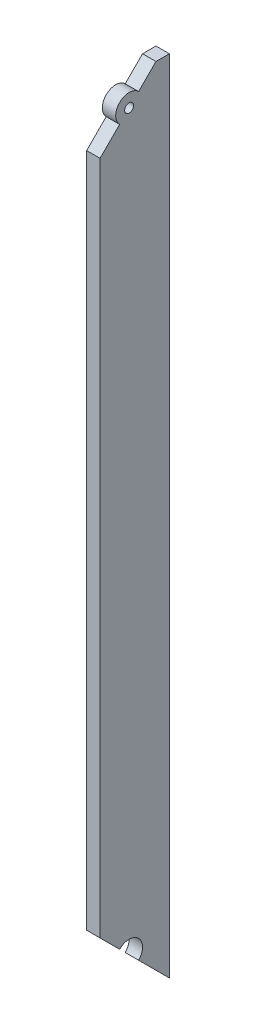
ISO-10303-21;
HEADER;
FILE_DESCRIPTION(('STEP AP214'),'2;1');
FILE_NAME('part.step','',(''),(''),'','','');
FILE_SCHEMA(('AUTOMOTIVE_DESIGN { 1 0 10303 214 1 1 1 1 }'));
ENDSEC;
DATA;
#1=APPLICATION_CONTEXT('core data for automotive mechanical design processes');
#2=APPLICATION_PROTOCOL_DEFINITION('international standard','automotive_design',2000,#1);
#3=PRODUCT_CONTEXT('',#1,'mechanical');
#4=PRODUCT('Part','Part','',(#3));
#5=PRODUCT_RELATED_PRODUCT_CATEGORY('part','',(#4));
#6=PRODUCT_DEFINITION_FORMATION('','',#4);
#7=PRODUCT_DEFINITION_CONTEXT('part definition',#1,'design');
#8=PRODUCT_DEFINITION('design','',#6,#7);
#9=PRODUCT_DEFINITION_SHAPE('','',#8);
#10=(LENGTH_UNIT() NAMED_UNIT(*) SI_UNIT(.MILLI.,.METRE.));
#11=(NAMED_UNIT(*) PLANE_ANGLE_UNIT() SI_UNIT($,.RADIAN.));
#12=(NAMED_UNIT(*) SI_UNIT($,.STERADIAN.) SOLID_ANGLE_UNIT());
#13=UNCERTAINTY_MEASURE_WITH_UNIT(LENGTH_MEASURE(1.E-05),#10,'distance_accuracy_value','');
#14=(GEOMETRIC_REPRESENTATION_CONTEXT(3) GLOBAL_UNCERTAINTY_ASSIGNED_CONTEXT((#13)) GLOBAL_UNIT_ASSIGNED_CONTEXT((#10,
#11,#12)) REPRESENTATION_CONTEXT('',''));
#15=CARTESIAN_POINT('',(0.,0.,0.));
#16=DIRECTION('',(0.,0.,1.));
#17=DIRECTION('',(1.,0.,0.));
#18=AXIS2_PLACEMENT_3D('',#15,#16,#17);
#19=CARTESIAN_POINT('',(6.,0.,0.));
#20=DIRECTION('',(0.,0.707106781186549,-0.707106781186546));
#21=DIRECTION('',(0.,0.707106781186546,0.707106781186549));
#22=AXIS2_PLACEMENT_3D('',#19,#20,#21);
#23=PLANE('',#22);
#24=DIRECTION('',(0.,-0.707106781186546,-0.707106781186549));
#25=VECTOR('',#24,1.);
#26=CARTESIAN_POINT('',(0.,0.,0.));
#27=LINE('',#26,#25);
#28=CARTESIAN_POINT('',(0.,24.9999999999999,25.));
#29=VERTEX_POINT('',#28);
#30=CARTESIAN_POINT('',(0.,16.2426406871193,16.2426406871193));
#31=VERTEX_POINT('',#30);
#32=EDGE_CURVE('E128',#29,#31,#27,.T.);
#33=ORIENTED_EDGE('',*,*,#32,.T.);
#34=DIRECTION('',(1.,0.,0.));
#35=VECTOR('',#34,1.);
#36=CARTESIAN_POINT('',(0.,16.2426406871193,16.2426406871193));
#37=LINE('',#36,#35);
#38=CARTESIAN_POINT('',(6.,16.2426406871193,16.2426406871193));
#39=VERTEX_POINT('',#38);
#40=EDGE_CURVE('E57',#31,#39,#37,.T.);
#41=ORIENTED_EDGE('',*,*,#40,.T.);
#42=DIRECTION('',(0.,-0.707106781186546,-0.707106781186549));
#43=VECTOR('',#42,1.);
#44=CARTESIAN_POINT('',(6.,0.,0.));
#45=LINE('',#44,#43);
#46=CARTESIAN_POINT('',(6.,24.9999999999999,25.));
#47=VERTEX_POINT('',#46);
#48=EDGE_CURVE('E157',#47,#39,#45,.T.);
#49=ORIENTED_EDGE('',*,*,#48,.F.);
#50=DIRECTION('',(-1.,0.,0.));
#51=VECTOR('',#50,1.);
#52=CARTESIAN_POINT('',(6.,24.9999999999999,25.));
#53=LINE('',#52,#51);
#54=EDGE_CURVE('E47',#47,#29,#53,.T.);
#55=ORIENTED_EDGE('',*,*,#54,.T.);
#56=EDGE_LOOP('',(#33,#41,#49,#55));
#57=FACE_BOUND('',#56,.T.);
#58=ADVANCED_FACE('F41',(#57),#23,.F.);
#59=CARTESIAN_POINT('',(6.,175.999999999998,176.));
#60=DIRECTION('',(0.,0.707106781186544,0.707106781186551));
#61=DIRECTION('',(0.,-0.707106781186551,0.707106781186544));
#62=AXIS2_PLACEMENT_3D('',#59,#60,#61);
#63=PLANE('',#62);
#64=DIRECTION('',(1.,0.,0.));
#65=VECTOR('',#64,1.);
#66=CARTESIAN_POINT('',(-16.9705627484772,335.75735931288,16.2426406871193));
#67=LINE('',#66,#65);
#68=CARTESIAN_POINT('',(0.,335.75735931288,16.2426406871193));
#69=VERTEX_POINT('',#68);
#70=CARTESIAN_POINT('',(6.,335.75735931288,16.2426406871193));
#71=VERTEX_POINT('',#70);
#72=EDGE_CURVE('E134',#69,#71,#67,.T.);
#73=ORIENTED_EDGE('',*,*,#72,.F.);
#74=DIRECTION('',(0.,0.707106781186552,-0.707106781186544));
#75=VECTOR('',#74,1.);
#76=CARTESIAN_POINT('',(0.,175.999999999998,176.));
#77=LINE('',#76,#75);
#78=CARTESIAN_POINT('',(0.,327.,25.));
#79=VERTEX_POINT('',#78);
#80=EDGE_CURVE('E141',#79,#69,#77,.T.);
#81=ORIENTED_EDGE('',*,*,#80,.F.);
#82=DIRECTION('',(-1.,0.,0.));
#83=VECTOR('',#82,1.);
#84=CARTESIAN_POINT('',(6.,327.,25.));
#85=LINE('',#84,#83);
#86=CARTESIAN_POINT('',(6.,327.,25.));
#87=VERTEX_POINT('',#86);
#88=EDGE_CURVE('E143',#87,#79,#85,.T.);
#89=ORIENTED_EDGE('',*,*,#88,.F.);
#90=DIRECTION('',(0.,0.707106781186552,-0.707106781186544));
#91=VECTOR('',#90,1.);
#92=CARTESIAN_POINT('',(6.,175.999999999998,176.));
#93=LINE('',#92,#91);
#94=EDGE_CURVE('E150',#87,#71,#93,.T.);
#95=ORIENTED_EDGE('',*,*,#94,.T.);
#96=EDGE_LOOP('',(#73,#81,#89,#95));
#97=FACE_BOUND('',#96,.T.);
#98=ADVANCED_FACE('F166',(#97),#63,.T.);
#99=CARTESIAN_POINT('',(6.,0.,25.));
#100=DIRECTION('',(0.,0.,1.));
#101=DIRECTION('',(0.,-1.,0.));
#102=AXIS2_PLACEMENT_3D('',#99,#100,#101);
#103=PLANE('',#102);
#104=DIRECTION('',(0.,1.,0.));
#105=VECTOR('',#104,1.);
#106=CARTESIAN_POINT('',(0.,0.,25.));
#107=LINE('',#106,#105);
#108=EDGE_CURVE('E129',#29,#79,#107,.T.);
#109=ORIENTED_EDGE('',*,*,#108,.F.);
#110=ORIENTED_EDGE('',*,*,#54,.F.);
#111=DIRECTION('',(0.,1.,0.));
#112=VECTOR('',#111,1.);
#113=CARTESIAN_POINT('',(6.,0.,25.));
#114=LINE('',#113,#112);
#115=EDGE_CURVE('E144',#47,#87,#114,.T.);
#116=ORIENTED_EDGE('',*,*,#115,.T.);
#117=ORIENTED_EDGE('',*,*,#88,.T.);
#118=EDGE_LOOP('',(#109,#110,#116,#117));
#119=FACE_BOUND('',#118,.T.);
#120=ADVANCED_FACE('F43',(#119),#103,.T.);
#121=CARTESIAN_POINT('',(6.,7.7573593128807,7.75735931288073));
#122=VERTEX_POINT('',#121);
#123=CARTESIAN_POINT('',(6.,-6.00000000000002,-6.00000000000004));
#124=VERTEX_POINT('',#123);
#125=EDGE_CURVE('E121',#122,#124,#45,.T.);
#126=ORIENTED_EDGE('',*,*,#125,.F.);
#127=DIRECTION('',(1.,0.,0.));
#128=VECTOR('',#127,1.);
#129=CARTESIAN_POINT('',(0.,7.7573593128807,7.75735931288073));
#130=LINE('',#129,#128);
#131=CARTESIAN_POINT('',(0.,7.7573593128807,7.75735931288073));
#132=VERTEX_POINT('',#131);
#133=EDGE_CURVE('E109',#122,#132,#130,.F.);
#134=ORIENTED_EDGE('',*,*,#133,.T.);
#135=CARTESIAN_POINT('',(0.,-6.00000000000002,-6.00000000000004));
#136=VERTEX_POINT('',#135);
#137=EDGE_CURVE('E117',#132,#136,#27,.T.);
#138=ORIENTED_EDGE('',*,*,#137,.T.);
#139=DIRECTION('',(-1.,0.,0.));
#140=VECTOR('',#139,1.);
#141=CARTESIAN_POINT('',(6.,-6.00000000000002,-6.00000000000004));
#142=LINE('',#141,#140);
#143=EDGE_CURVE('E155',#124,#136,#142,.T.);
#144=ORIENTED_EDGE('',*,*,#143,.F.);
#145=EDGE_LOOP('',(#126,#134,#138,#144));
#146=FACE_BOUND('',#145,.T.);
#147=ADVANCED_FACE('F120',(#146),#23,.F.);
#148=CARTESIAN_POINT('',(6.,0.,-6.00000000000004));
#149=DIRECTION('',(0.,0.,-1.));
#150=DIRECTION('',(0.,1.,0.));
#151=AXIS2_PLACEMENT_3D('',#148,#149,#150);
#152=PLANE('',#151);
#153=DIRECTION('',(0.,-1.,0.));
#154=VECTOR('',#153,1.);
#155=CARTESIAN_POINT('',(0.,0.,-6.00000000000004));
#156=LINE('',#155,#154);
#157=CARTESIAN_POINT('',(0.,352.,-6.));
#158=VERTEX_POINT('',#157);
#159=EDGE_CURVE('E127',#158,#136,#156,.T.);
#160=ORIENTED_EDGE('',*,*,#159,.F.);
#161=DIRECTION('',(-1.,0.,0.));
#162=VECTOR('',#161,1.);
#163=CARTESIAN_POINT('',(6.,352.,-6.));
#164=LINE('',#163,#162);
#165=CARTESIAN_POINT('',(6.,352.,-6.));
#166=VERTEX_POINT('',#165);
#167=EDGE_CURVE('E149',#166,#158,#164,.T.);
#168=ORIENTED_EDGE('',*,*,#167,.F.);
#169=DIRECTION('',(0.,-1.,0.));
#170=VECTOR('',#169,1.);
#171=CARTESIAN_POINT('',(6.,0.,-6.00000000000004));
#172=LINE('',#171,#170);
#173=EDGE_CURVE('E177',#166,#124,#172,.T.);
#174=ORIENTED_EDGE('',*,*,#173,.T.);
#175=ORIENTED_EDGE('',*,*,#143,.T.);
#176=EDGE_LOOP('',(#160,#168,#174,#175));
#177=FACE_BOUND('',#176,.T.);
#178=ADVANCED_FACE('F196',(#177),#152,.T.);
#179=CARTESIAN_POINT('',(6.,352.,0.));
#180=DIRECTION('',(0.,1.,0.));
#181=DIRECTION('',(0.,0.,1.));
#182=AXIS2_PLACEMENT_3D('',#179,#180,#181);
#183=PLANE('',#182);
#184=DIRECTION('',(0.,0.,-1.));
#185=VECTOR('',#184,1.);
#186=CARTESIAN_POINT('',(0.,352.,0.));
#187=LINE('',#186,#185);
#188=CARTESIAN_POINT('',(0.,352.,0.));
#189=VERTEX_POINT('',#188);
#190=EDGE_CURVE('E140',#189,#158,#187,.T.);
#191=ORIENTED_EDGE('',*,*,#190,.F.);
#192=DIRECTION('',(-1.,0.,0.));
#193=VECTOR('',#192,1.);
#194=CARTESIAN_POINT('',(6.,352.,0.));
#195=LINE('',#194,#193);
#196=CARTESIAN_POINT('',(6.,352.,0.));
#197=VERTEX_POINT('',#196);
#198=EDGE_CURVE('E148',#197,#189,#195,.T.);
#199=ORIENTED_EDGE('',*,*,#198,.F.);
#200=DIRECTION('',(0.,0.,-1.));
#201=VECTOR('',#200,1.);
#202=CARTESIAN_POINT('',(6.,352.,0.));
#203=LINE('',#202,#201);
#204=EDGE_CURVE('E176',#197,#166,#203,.T.);
#205=ORIENTED_EDGE('',*,*,#204,.T.);
#206=ORIENTED_EDGE('',*,*,#167,.T.);
#207=EDGE_LOOP('',(#191,#199,#205,#206));
#208=FACE_BOUND('',#207,.T.);
#209=ADVANCED_FACE('F195',(#208),#183,.T.);
#210=DIRECTION('',(1.,0.,0.));
#211=VECTOR('',#210,1.);
#212=CARTESIAN_POINT('',(-16.9705627484772,344.242640687119,7.75735931288075));
#213=LINE('',#212,#211);
#214=CARTESIAN_POINT('',(6.,344.242640687119,7.75735931288079));
#215=VERTEX_POINT('',#214);
#216=CARTESIAN_POINT('',(0.,344.242640687119,7.75735931288076));
#217=VERTEX_POINT('',#216);
#218=EDGE_CURVE('E168',#215,#217,#213,.F.);
#219=ORIENTED_EDGE('',*,*,#218,.F.);
#220=EDGE_CURVE('E183',#215,#197,#93,.T.);
#221=ORIENTED_EDGE('',*,*,#220,.T.);
#222=ORIENTED_EDGE('',*,*,#198,.T.);
#223=EDGE_CURVE('E137',#217,#189,#77,.T.);
#224=ORIENTED_EDGE('',*,*,#223,.F.);
#225=EDGE_LOOP('',(#219,#221,#222,#224));
#226=FACE_BOUND('',#225,.T.);
#227=ADVANCED_FACE('F188',(#226),#63,.T.);
#228=CARTESIAN_POINT('',(6.,0.,0.));
#229=DIRECTION('',(1.,0.,0.));
#230=DIRECTION('',(0.,0.,-1.));
#231=AXIS2_PLACEMENT_3D('',#228,#229,#230);
#232=PLANE('',#231);
#233=CARTESIAN_POINT('',(6.,340.,12.));
#234=DIRECTION('',(1.,0.,0.));
#235=DIRECTION('',(0.,0.,-1.));
#236=AXIS2_PLACEMENT_3D('',#233,#234,#235);
#237=CIRCLE('',#236,2.);
#238=CARTESIAN_POINT('',(6.,340.,10.));
#239=VERTEX_POINT('',#238);
#240=EDGE_CURVE('E238',#239,#239,#237,.T.);
#241=ORIENTED_EDGE('',*,*,#240,.F.);
#242=EDGE_LOOP('',(#241));
#243=FACE_BOUND('',#242,.T.);
#244=CARTESIAN_POINT('',(6.,12.,12.));
#245=DIRECTION('',(1.,0.,0.));
#246=DIRECTION('',(0.,0.,-1.));
#247=AXIS2_PLACEMENT_3D('',#244,#245,#246);
#248=CIRCLE('',#247,6.);
#249=EDGE_CURVE('E237',#122,#39,#248,.T.);
#250=ORIENTED_EDGE('',*,*,#249,.F.);
#251=ORIENTED_EDGE('',*,*,#125,.T.);
#252=ORIENTED_EDGE('',*,*,#173,.F.);
#253=ORIENTED_EDGE('',*,*,#204,.F.);
#254=ORIENTED_EDGE('',*,*,#220,.F.);
#255=CARTESIAN_POINT('',(6.,340.,12.));
#256=DIRECTION('',(1.,0.,0.));
#257=DIRECTION('',(0.,0.,-1.));
#258=AXIS2_PLACEMENT_3D('',#255,#256,#257);
#259=CIRCLE('',#258,6.00000000000001);
#260=EDGE_CURVE('E248',#215,#71,#259,.T.);
#261=ORIENTED_EDGE('',*,*,#260,.T.);
#262=ORIENTED_EDGE('',*,*,#94,.F.);
#263=ORIENTED_EDGE('',*,*,#115,.F.);
#264=ORIENTED_EDGE('',*,*,#48,.T.);
#265=EDGE_LOOP('',(#250,#251,#252,#253,#254,#261,#262,#263,#264));
#266=FACE_BOUND('',#265,.T.);
#267=ADVANCED_FACE('F192',(#243,#266),#232,.T.);
#268=CARTESIAN_POINT('',(0.,0.,0.));
#269=DIRECTION('',(1.,0.,0.));
#270=DIRECTION('',(0.,0.,-1.));
#271=AXIS2_PLACEMENT_3D('',#268,#269,#270);
#272=PLANE('',#271);
#273=CARTESIAN_POINT('',(0.,340.,12.));
#274=DIRECTION('',(1.,0.,0.));
#275=DIRECTION('',(0.,0.,-1.));
#276=AXIS2_PLACEMENT_3D('',#273,#274,#275);
#277=CIRCLE('',#276,2.);
#278=CARTESIAN_POINT('',(0.,340.,10.));
#279=VERTEX_POINT('',#278);
#280=EDGE_CURVE('E125',#279,#279,#277,.T.);
#281=ORIENTED_EDGE('',*,*,#280,.T.);
#282=EDGE_LOOP('',(#281));
#283=FACE_BOUND('',#282,.T.);
#284=ORIENTED_EDGE('',*,*,#137,.F.);
#285=CARTESIAN_POINT('',(0.,12.,12.));
#286=DIRECTION('',(1.,0.,0.));
#287=DIRECTION('',(0.,0.,-1.));
#288=AXIS2_PLACEMENT_3D('',#285,#286,#287);
#289=CIRCLE('',#288,6.);
#290=EDGE_CURVE('E11',#132,#31,#289,.T.);
#291=ORIENTED_EDGE('',*,*,#290,.T.);
#292=ORIENTED_EDGE('',*,*,#32,.F.);
#293=ORIENTED_EDGE('',*,*,#108,.T.);
#294=ORIENTED_EDGE('',*,*,#80,.T.);
#295=CARTESIAN_POINT('',(0.,340.,12.));
#296=DIRECTION('',(1.,0.,0.));
#297=DIRECTION('',(0.,0.,-1.));
#298=AXIS2_PLACEMENT_3D('',#295,#296,#297);
#299=CIRCLE('',#298,6.00000000000001);
#300=EDGE_CURVE('E65',#69,#217,#299,.F.);
#301=ORIENTED_EDGE('',*,*,#300,.T.);
#302=ORIENTED_EDGE('',*,*,#223,.T.);
#303=ORIENTED_EDGE('',*,*,#190,.T.);
#304=ORIENTED_EDGE('',*,*,#159,.T.);
#305=EDGE_LOOP('',(#284,#291,#292,#293,#294,#301,#302,#303,#304));
#306=FACE_BOUND('',#305,.T.);
#307=ADVANCED_FACE('F124',(#283,#306),#272,.F.);
#308=CARTESIAN_POINT('',(-16.9705627484772,340.,12.));
#309=DIRECTION('',(1.,0.,0.));
#310=DIRECTION('',(0.,0.,-1.));
#311=AXIS2_PLACEMENT_3D('',#308,#309,#310);
#312=CYLINDRICAL_SURFACE('',#311,6.00000000000001);
#313=ORIENTED_EDGE('',*,*,#300,.F.);
#314=ORIENTED_EDGE('',*,*,#72,.T.);
#315=ORIENTED_EDGE('',*,*,#260,.F.);
#316=ORIENTED_EDGE('',*,*,#218,.T.);
#317=EDGE_LOOP('',(#313,#314,#315,#316));
#318=FACE_BOUND('',#317,.T.);
#319=ADVANCED_FACE('F221',(#318),#312,.T.);
#320=CARTESIAN_POINT('',(0.,12.,12.));
#321=DIRECTION('',(1.,0.,0.));
#322=DIRECTION('',(0.,0.,-1.));
#323=AXIS2_PLACEMENT_3D('',#320,#321,#322);
#324=CYLINDRICAL_SURFACE('',#323,6.);
#325=ORIENTED_EDGE('',*,*,#290,.F.);
#326=ORIENTED_EDGE('',*,*,#133,.F.);
#327=ORIENTED_EDGE('',*,*,#249,.T.);
#328=ORIENTED_EDGE('',*,*,#40,.F.);
#329=EDGE_LOOP('',(#325,#326,#327,#328));
#330=FACE_BOUND('',#329,.T.);
#331=ADVANCED_FACE('F110',(#330),#324,.F.);
#332=CARTESIAN_POINT('',(0.,340.,12.));
#333=DIRECTION('',(1.,0.,0.));
#334=DIRECTION('',(0.,0.,-1.));
#335=AXIS2_PLACEMENT_3D('',#332,#333,#334);
#336=CYLINDRICAL_SURFACE('',#335,2.);
#337=ORIENTED_EDGE('',*,*,#280,.F.);
#338=EDGE_LOOP('',(#337));
#339=FACE_BOUND('',#338,.T.);
#340=ORIENTED_EDGE('',*,*,#240,.T.);
#341=EDGE_LOOP('',(#340));
#342=FACE_BOUND('',#341,.T.);
#343=ADVANCED_FACE('F228',(#339,#342),#336,.F.);
#344=CLOSED_SHELL('',(#58,#98,#120,#147,#178,#209,#227,#267,#307,#319,#331,#343));
#345=MANIFOLD_SOLID_BREP('B2',#344);
#346=ADVANCED_BREP_SHAPE_REPRESENTATION('',(#18,#345),#14);
#347=SHAPE_DEFINITION_REPRESENTATION(#9,#346);
ENDSEC;
END-ISO-10303-21;
